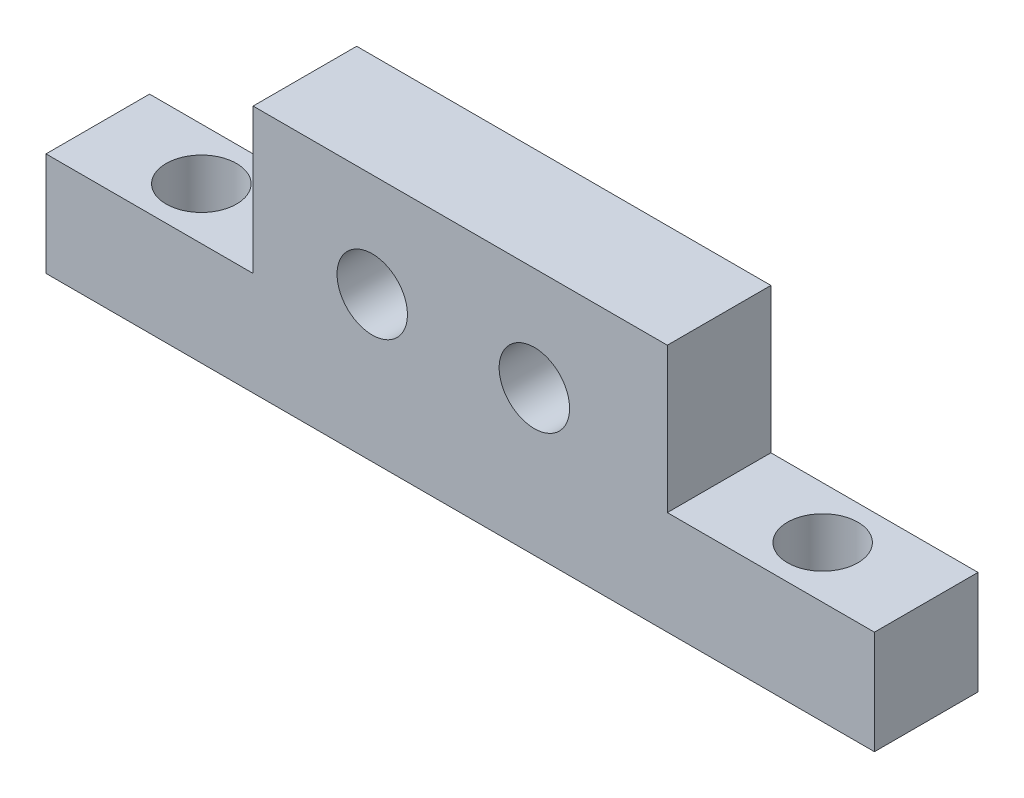
ISO-10303-21;
HEADER;
FILE_DESCRIPTION(('STEP AP214'),'2;1');
FILE_NAME('part.step','',(''),(''),'','','');
FILE_SCHEMA(('AUTOMOTIVE_DESIGN { 1 0 10303 214 1 1 1 1 }'));
ENDSEC;
DATA;
#1=APPLICATION_CONTEXT('core data for automotive mechanical design processes');
#2=APPLICATION_PROTOCOL_DEFINITION('international standard','automotive_design',2000,#1);
#3=PRODUCT_CONTEXT('',#1,'mechanical');
#4=PRODUCT('Part','Part','',(#3));
#5=PRODUCT_RELATED_PRODUCT_CATEGORY('part','',(#4));
#6=PRODUCT_DEFINITION_FORMATION('','',#4);
#7=PRODUCT_DEFINITION_CONTEXT('part definition',#1,'design');
#8=PRODUCT_DEFINITION('design','',#6,#7);
#9=PRODUCT_DEFINITION_SHAPE('','',#8);
#10=(LENGTH_UNIT() NAMED_UNIT(*) SI_UNIT(.MILLI.,.METRE.));
#11=(NAMED_UNIT(*) PLANE_ANGLE_UNIT() SI_UNIT($,.RADIAN.));
#12=(NAMED_UNIT(*) SI_UNIT($,.STERADIAN.) SOLID_ANGLE_UNIT());
#13=UNCERTAINTY_MEASURE_WITH_UNIT(LENGTH_MEASURE(1.E-05),#10,'distance_accuracy_value','');
#14=(GEOMETRIC_REPRESENTATION_CONTEXT(3) GLOBAL_UNCERTAINTY_ASSIGNED_CONTEXT((#13)) GLOBAL_UNIT_ASSIGNED_CONTEXT((#10,
#11,#12)) REPRESENTATION_CONTEXT('',''));
#15=CARTESIAN_POINT('',(0.,0.,0.));
#16=DIRECTION('',(0.,0.,1.));
#17=DIRECTION('',(1.,0.,0.));
#18=AXIS2_PLACEMENT_3D('',#15,#16,#17);
#19=CARTESIAN_POINT('',(-10.,-3.5,5.));
#20=DIRECTION('',(1.,0.,0.));
#21=DIRECTION('',(0.,0.,-1.));
#22=AXIS2_PLACEMENT_3D('',#19,#20,#21);
#23=PLANE('',#22);
#24=DIRECTION('',(0.,-1.,0.));
#25=VECTOR('',#24,1.);
#26=CARTESIAN_POINT('',(-10.,-3.5,0.));
#27=LINE('',#26,#25);
#28=CARTESIAN_POINT('',(-10.,3.5,0.));
#29=VERTEX_POINT('',#28);
#30=CARTESIAN_POINT('',(-10.,-3.5,0.));
#31=VERTEX_POINT('',#30);
#32=EDGE_CURVE('E146',#29,#31,#27,.T.);
#33=ORIENTED_EDGE('',*,*,#32,.T.);
#34=DIRECTION('',(0.,0.,-1.));
#35=VECTOR('',#34,1.);
#36=CARTESIAN_POINT('',(-10.,-3.5,5.));
#37=LINE('',#36,#35);
#38=CARTESIAN_POINT('',(-10.,-3.5,5.));
#39=VERTEX_POINT('',#38);
#40=EDGE_CURVE('E11',#39,#31,#37,.T.);
#41=ORIENTED_EDGE('',*,*,#40,.F.);
#42=DIRECTION('',(0.,-1.,0.));
#43=VECTOR('',#42,1.);
#44=CARTESIAN_POINT('',(-10.,-3.5,5.));
#45=LINE('',#44,#43);
#46=CARTESIAN_POINT('',(-10.,3.5,5.));
#47=VERTEX_POINT('',#46);
#48=EDGE_CURVE('E169',#47,#39,#45,.T.);
#49=ORIENTED_EDGE('',*,*,#48,.F.);
#50=DIRECTION('',(0.,0.,-1.));
#51=VECTOR('',#50,1.);
#52=CARTESIAN_POINT('',(-10.,3.5,5.));
#53=LINE('',#52,#51);
#54=EDGE_CURVE('E142',#47,#29,#53,.T.);
#55=ORIENTED_EDGE('',*,*,#54,.T.);
#56=EDGE_LOOP('',(#33,#41,#49,#55));
#57=FACE_BOUND('',#56,.T.);
#58=ADVANCED_FACE('F45',(#57),#23,.F.);
#59=CARTESIAN_POINT('',(-20.,-3.5,5.));
#60=DIRECTION('',(0.,-1.,0.));
#61=DIRECTION('',(0.,0.,-1.));
#62=AXIS2_PLACEMENT_3D('',#59,#60,#61);
#63=PLANE('',#62);
#64=CARTESIAN_POINT('',(-15.,-3.5,2.5));
#65=DIRECTION('',(0.,1.,0.));
#66=DIRECTION('',(0.,0.,1.));
#67=AXIS2_PLACEMENT_3D('',#64,#65,#66);
#68=CIRCLE('',#67,1.69999999999999);
#69=CARTESIAN_POINT('',(-15.,-3.5,4.19999999999999));
#70=VERTEX_POINT('',#69);
#71=EDGE_CURVE('E240',#70,#70,#68,.T.);
#72=ORIENTED_EDGE('',*,*,#71,.F.);
#73=EDGE_LOOP('',(#72));
#74=FACE_BOUND('',#73,.T.);
#75=DIRECTION('',(-1.,0.,0.));
#76=VECTOR('',#75,1.);
#77=CARTESIAN_POINT('',(-20.,-3.5,0.));
#78=LINE('',#77,#76);
#79=CARTESIAN_POINT('',(-20.,-3.5,0.));
#80=VERTEX_POINT('',#79);
#81=EDGE_CURVE('E150',#31,#80,#78,.T.);
#82=ORIENTED_EDGE('',*,*,#81,.T.);
#83=DIRECTION('',(0.,0.,-1.));
#84=VECTOR('',#83,1.);
#85=CARTESIAN_POINT('',(-20.,-3.5,5.));
#86=LINE('',#85,#84);
#87=CARTESIAN_POINT('',(-20.,-3.5,5.));
#88=VERTEX_POINT('',#87);
#89=EDGE_CURVE('E54',#88,#80,#86,.T.);
#90=ORIENTED_EDGE('',*,*,#89,.F.);
#91=DIRECTION('',(-1.,0.,0.));
#92=VECTOR('',#91,1.);
#93=CARTESIAN_POINT('',(-20.,-3.5,5.));
#94=LINE('',#93,#92);
#95=EDGE_CURVE('E105',#39,#88,#94,.T.);
#96=ORIENTED_EDGE('',*,*,#95,.F.);
#97=ORIENTED_EDGE('',*,*,#40,.T.);
#98=EDGE_LOOP('',(#82,#90,#96,#97));
#99=FACE_BOUND('',#98,.T.);
#100=ADVANCED_FACE('F247',(#74,#99),#63,.F.);
#101=CARTESIAN_POINT('',(-20.,-3.5,5.));
#102=DIRECTION('',(1.,0.,0.));
#103=DIRECTION('',(0.,0.,-1.));
#104=AXIS2_PLACEMENT_3D('',#101,#102,#103);
#105=PLANE('',#104);
#106=DIRECTION('',(0.,-1.,0.));
#107=VECTOR('',#106,1.);
#108=CARTESIAN_POINT('',(-20.,-3.5,0.));
#109=LINE('',#108,#107);
#110=CARTESIAN_POINT('',(-20.,-8.5,0.));
#111=VERTEX_POINT('',#110);
#112=EDGE_CURVE('E154',#80,#111,#109,.T.);
#113=ORIENTED_EDGE('',*,*,#112,.T.);
#114=DIRECTION('',(0.,0.,-1.));
#115=VECTOR('',#114,1.);
#116=CARTESIAN_POINT('',(-20.,-8.5,5.));
#117=LINE('',#116,#115);
#118=CARTESIAN_POINT('',(-20.,-8.5,5.));
#119=VERTEX_POINT('',#118);
#120=EDGE_CURVE('E180',#119,#111,#117,.T.);
#121=ORIENTED_EDGE('',*,*,#120,.F.);
#122=DIRECTION('',(0.,-1.,0.));
#123=VECTOR('',#122,1.);
#124=CARTESIAN_POINT('',(-20.,-3.5,5.));
#125=LINE('',#124,#123);
#126=EDGE_CURVE('E190',#88,#119,#125,.T.);
#127=ORIENTED_EDGE('',*,*,#126,.F.);
#128=ORIENTED_EDGE('',*,*,#89,.T.);
#129=EDGE_LOOP('',(#113,#121,#127,#128));
#130=FACE_BOUND('',#129,.T.);
#131=ADVANCED_FACE('F188',(#130),#105,.F.);
#132=CARTESIAN_POINT('',(-20.,-8.5,5.));
#133=DIRECTION('',(0.,1.,0.));
#134=DIRECTION('',(0.,0.,1.));
#135=AXIS2_PLACEMENT_3D('',#132,#133,#134);
#136=PLANE('',#135);
#137=CARTESIAN_POINT('',(-15.,-8.5,2.5));
#138=DIRECTION('',(0.,1.,0.));
#139=DIRECTION('',(0.,0.,1.));
#140=AXIS2_PLACEMENT_3D('',#137,#138,#139);
#141=CIRCLE('',#140,1.7);
#142=CARTESIAN_POINT('',(-15.,-8.5,4.2));
#143=VERTEX_POINT('',#142);
#144=EDGE_CURVE('E236',#143,#143,#141,.T.);
#145=ORIENTED_EDGE('',*,*,#144,.T.);
#146=EDGE_LOOP('',(#145));
#147=FACE_BOUND('',#146,.T.);
#148=CARTESIAN_POINT('',(15.,-8.5,2.5));
#149=DIRECTION('',(0.,1.,0.));
#150=DIRECTION('',(0.,0.,1.));
#151=AXIS2_PLACEMENT_3D('',#148,#149,#150);
#152=CIRCLE('',#151,1.7);
#153=CARTESIAN_POINT('',(15.,-8.5,4.2));
#154=VERTEX_POINT('',#153);
#155=EDGE_CURVE('E228',#154,#154,#152,.T.);
#156=ORIENTED_EDGE('',*,*,#155,.T.);
#157=EDGE_LOOP('',(#156));
#158=FACE_BOUND('',#157,.T.);
#159=DIRECTION('',(1.,0.,0.));
#160=VECTOR('',#159,1.);
#161=CARTESIAN_POINT('',(-20.,-8.5,0.));
#162=LINE('',#161,#160);
#163=CARTESIAN_POINT('',(20.,-8.5,0.));
#164=VERTEX_POINT('',#163);
#165=EDGE_CURVE('E157',#111,#164,#162,.T.);
#166=ORIENTED_EDGE('',*,*,#165,.T.);
#167=DIRECTION('',(0.,0.,-1.));
#168=VECTOR('',#167,1.);
#169=CARTESIAN_POINT('',(20.,-8.5,5.));
#170=LINE('',#169,#168);
#171=CARTESIAN_POINT('',(20.,-8.5,5.));
#172=VERTEX_POINT('',#171);
#173=EDGE_CURVE('E176',#172,#164,#170,.T.);
#174=ORIENTED_EDGE('',*,*,#173,.F.);
#175=DIRECTION('',(1.,0.,0.));
#176=VECTOR('',#175,1.);
#177=CARTESIAN_POINT('',(-20.,-8.5,5.));
#178=LINE('',#177,#176);
#179=EDGE_CURVE('E203',#119,#172,#178,.T.);
#180=ORIENTED_EDGE('',*,*,#179,.F.);
#181=ORIENTED_EDGE('',*,*,#120,.T.);
#182=EDGE_LOOP('',(#166,#174,#180,#181));
#183=FACE_BOUND('',#182,.T.);
#184=ADVANCED_FACE('F198',(#147,#158,#183),#136,.F.);
#185=CARTESIAN_POINT('',(20.,-3.5,5.));
#186=DIRECTION('',(-1.,0.,0.));
#187=DIRECTION('',(0.,0.,1.));
#188=AXIS2_PLACEMENT_3D('',#185,#186,#187);
#189=PLANE('',#188);
#190=DIRECTION('',(0.,1.,0.));
#191=VECTOR('',#190,1.);
#192=CARTESIAN_POINT('',(20.,-3.5,0.));
#193=LINE('',#192,#191);
#194=CARTESIAN_POINT('',(20.,-3.5,0.));
#195=VERTEX_POINT('',#194);
#196=EDGE_CURVE('E160',#164,#195,#193,.T.);
#197=ORIENTED_EDGE('',*,*,#196,.T.);
#198=DIRECTION('',(0.,0.,-1.));
#199=VECTOR('',#198,1.);
#200=CARTESIAN_POINT('',(20.,-3.5,5.));
#201=LINE('',#200,#199);
#202=CARTESIAN_POINT('',(20.,-3.5,5.));
#203=VERTEX_POINT('',#202);
#204=EDGE_CURVE('E135',#203,#195,#201,.T.);
#205=ORIENTED_EDGE('',*,*,#204,.F.);
#206=DIRECTION('',(0.,1.,0.));
#207=VECTOR('',#206,1.);
#208=CARTESIAN_POINT('',(20.,-3.5,5.));
#209=LINE('',#208,#207);
#210=EDGE_CURVE('E124',#172,#203,#209,.T.);
#211=ORIENTED_EDGE('',*,*,#210,.F.);
#212=ORIENTED_EDGE('',*,*,#173,.T.);
#213=EDGE_LOOP('',(#197,#205,#211,#212));
#214=FACE_BOUND('',#213,.T.);
#215=ADVANCED_FACE('F201',(#214),#189,.F.);
#216=CARTESIAN_POINT('',(10.,-3.5,5.));
#217=DIRECTION('',(0.,-1.,0.));
#218=DIRECTION('',(0.,0.,-1.));
#219=AXIS2_PLACEMENT_3D('',#216,#217,#218);
#220=PLANE('',#219);
#221=CARTESIAN_POINT('',(15.,-3.5,2.5));
#222=DIRECTION('',(0.,1.,0.));
#223=DIRECTION('',(0.,0.,1.));
#224=AXIS2_PLACEMENT_3D('',#221,#222,#223);
#225=CIRCLE('',#224,1.69999999999999);
#226=CARTESIAN_POINT('',(15.,-3.5,4.19999999999999));
#227=VERTEX_POINT('',#226);
#228=EDGE_CURVE('E232',#227,#227,#225,.T.);
#229=ORIENTED_EDGE('',*,*,#228,.F.);
#230=EDGE_LOOP('',(#229));
#231=FACE_BOUND('',#230,.T.);
#232=DIRECTION('',(-1.,0.,0.));
#233=VECTOR('',#232,1.);
#234=CARTESIAN_POINT('',(10.,-3.5,0.));
#235=LINE('',#234,#233);
#236=CARTESIAN_POINT('',(10.,-3.5,0.));
#237=VERTEX_POINT('',#236);
#238=EDGE_CURVE('E133',#195,#237,#235,.T.);
#239=ORIENTED_EDGE('',*,*,#238,.T.);
#240=DIRECTION('',(0.,0.,-1.));
#241=VECTOR('',#240,1.);
#242=CARTESIAN_POINT('',(10.,-3.5,5.));
#243=LINE('',#242,#241);
#244=CARTESIAN_POINT('',(10.,-3.5,5.));
#245=VERTEX_POINT('',#244);
#246=EDGE_CURVE('E130',#245,#237,#243,.T.);
#247=ORIENTED_EDGE('',*,*,#246,.F.);
#248=DIRECTION('',(-1.,0.,0.));
#249=VECTOR('',#248,1.);
#250=CARTESIAN_POINT('',(10.,-3.5,5.));
#251=LINE('',#250,#249);
#252=EDGE_CURVE('E118',#203,#245,#251,.T.);
#253=ORIENTED_EDGE('',*,*,#252,.F.);
#254=ORIENTED_EDGE('',*,*,#204,.T.);
#255=EDGE_LOOP('',(#239,#247,#253,#254));
#256=FACE_BOUND('',#255,.T.);
#257=ADVANCED_FACE('F131',(#231,#256),#220,.F.);
#258=CARTESIAN_POINT('',(10.,-3.5,5.));
#259=DIRECTION('',(-1.,0.,0.));
#260=DIRECTION('',(0.,0.,1.));
#261=AXIS2_PLACEMENT_3D('',#258,#259,#260);
#262=PLANE('',#261);
#263=DIRECTION('',(0.,1.,0.));
#264=VECTOR('',#263,1.);
#265=CARTESIAN_POINT('',(10.,-3.5,0.));
#266=LINE('',#265,#264);
#267=CARTESIAN_POINT('',(10.,3.5,0.));
#268=VERTEX_POINT('',#267);
#269=EDGE_CURVE('E91',#237,#268,#266,.T.);
#270=ORIENTED_EDGE('',*,*,#269,.T.);
#271=DIRECTION('',(0.,0.,-1.));
#272=VECTOR('',#271,1.);
#273=CARTESIAN_POINT('',(10.,3.5,5.));
#274=LINE('',#273,#272);
#275=CARTESIAN_POINT('',(10.,3.5,5.));
#276=VERTEX_POINT('',#275);
#277=EDGE_CURVE('E136',#276,#268,#274,.T.);
#278=ORIENTED_EDGE('',*,*,#277,.F.);
#279=DIRECTION('',(0.,1.,0.));
#280=VECTOR('',#279,1.);
#281=CARTESIAN_POINT('',(10.,-3.5,5.));
#282=LINE('',#281,#280);
#283=EDGE_CURVE('E122',#245,#276,#282,.T.);
#284=ORIENTED_EDGE('',*,*,#283,.F.);
#285=ORIENTED_EDGE('',*,*,#246,.T.);
#286=EDGE_LOOP('',(#270,#278,#284,#285));
#287=FACE_BOUND('',#286,.T.);
#288=ADVANCED_FACE('F138',(#287),#262,.F.);
#289=CARTESIAN_POINT('',(10.,3.5,5.));
#290=DIRECTION('',(0.,-1.,0.));
#291=DIRECTION('',(1.,0.,0.));
#292=AXIS2_PLACEMENT_3D('',#289,#290,#291);
#293=PLANE('',#292);
#294=DIRECTION('',(-1.,0.,0.));
#295=VECTOR('',#294,1.);
#296=CARTESIAN_POINT('',(10.,3.5,0.));
#297=LINE('',#296,#295);
#298=EDGE_CURVE('E97',#268,#29,#297,.T.);
#299=ORIENTED_EDGE('',*,*,#298,.T.);
#300=ORIENTED_EDGE('',*,*,#54,.F.);
#301=DIRECTION('',(-1.,0.,0.));
#302=VECTOR('',#301,1.);
#303=CARTESIAN_POINT('',(10.,3.5,5.));
#304=LINE('',#303,#302);
#305=EDGE_CURVE('E62',#276,#47,#304,.T.);
#306=ORIENTED_EDGE('',*,*,#305,.F.);
#307=ORIENTED_EDGE('',*,*,#277,.T.);
#308=EDGE_LOOP('',(#299,#300,#306,#307));
#309=FACE_BOUND('',#308,.T.);
#310=ADVANCED_FACE('F252',(#309),#293,.F.);
#311=CARTESIAN_POINT('',(0.,0.,5.));
#312=DIRECTION('',(0.,0.,1.));
#313=DIRECTION('',(1.,0.,0.));
#314=AXIS2_PLACEMENT_3D('',#311,#312,#313);
#315=PLANE('',#314);
#316=CARTESIAN_POINT('',(3.58001928062672,-1.5,5.));
#317=DIRECTION('',(0.,0.,1.));
#318=DIRECTION('',(1.,0.,0.));
#319=AXIS2_PLACEMENT_3D('',#316,#317,#318);
#320=CIRCLE('',#319,1.7);
#321=CARTESIAN_POINT('',(5.28001928062672,-1.5,5.));
#322=VERTEX_POINT('',#321);
#323=EDGE_CURVE('E224',#322,#322,#320,.T.);
#324=ORIENTED_EDGE('',*,*,#323,.F.);
#325=EDGE_LOOP('',(#324));
#326=FACE_BOUND('',#325,.T.);
#327=CARTESIAN_POINT('',(-4.24828954634369,-1.5,5.));
#328=DIRECTION('',(0.,0.,1.));
#329=DIRECTION('',(1.,0.,0.));
#330=AXIS2_PLACEMENT_3D('',#327,#328,#329);
#331=CIRCLE('',#330,1.7);
#332=CARTESIAN_POINT('',(-2.5482895463437,-1.5,5.));
#333=VERTEX_POINT('',#332);
#334=EDGE_CURVE('E216',#333,#333,#331,.T.);
#335=ORIENTED_EDGE('',*,*,#334,.F.);
#336=EDGE_LOOP('',(#335));
#337=FACE_BOUND('',#336,.T.);
#338=ORIENTED_EDGE('',*,*,#48,.T.);
#339=ORIENTED_EDGE('',*,*,#95,.T.);
#340=ORIENTED_EDGE('',*,*,#126,.T.);
#341=ORIENTED_EDGE('',*,*,#179,.T.);
#342=ORIENTED_EDGE('',*,*,#210,.T.);
#343=ORIENTED_EDGE('',*,*,#252,.T.);
#344=ORIENTED_EDGE('',*,*,#283,.T.);
#345=ORIENTED_EDGE('',*,*,#305,.T.);
#346=EDGE_LOOP('',(#338,#339,#340,#341,#342,#343,#344,#345));
#347=FACE_BOUND('',#346,.T.);
#348=ADVANCED_FACE('F120',(#326,#337,#347),#315,.T.);
#349=CARTESIAN_POINT('',(0.,0.,0.));
#350=DIRECTION('',(0.,0.,1.));
#351=DIRECTION('',(1.,0.,0.));
#352=AXIS2_PLACEMENT_3D('',#349,#350,#351);
#353=PLANE('',#352);
#354=CARTESIAN_POINT('',(3.58001928062672,-1.5,0.));
#355=DIRECTION('',(0.,0.,1.));
#356=DIRECTION('',(1.,0.,0.));
#357=AXIS2_PLACEMENT_3D('',#354,#355,#356);
#358=CIRCLE('',#357,1.7);
#359=CARTESIAN_POINT('',(5.28001928062672,-1.5,0.));
#360=VERTEX_POINT('',#359);
#361=EDGE_CURVE('E220',#360,#360,#358,.T.);
#362=ORIENTED_EDGE('',*,*,#361,.T.);
#363=EDGE_LOOP('',(#362));
#364=FACE_BOUND('',#363,.T.);
#365=CARTESIAN_POINT('',(-4.24828954634369,-1.5,0.));
#366=DIRECTION('',(0.,0.,1.));
#367=DIRECTION('',(1.,0.,0.));
#368=AXIS2_PLACEMENT_3D('',#365,#366,#367);
#369=CIRCLE('',#368,1.7);
#370=CARTESIAN_POINT('',(-2.5482895463437,-1.5,0.));
#371=VERTEX_POINT('',#370);
#372=EDGE_CURVE('E151',#371,#371,#369,.T.);
#373=ORIENTED_EDGE('',*,*,#372,.T.);
#374=EDGE_LOOP('',(#373));
#375=FACE_BOUND('',#374,.T.);
#376=ORIENTED_EDGE('',*,*,#32,.F.);
#377=ORIENTED_EDGE('',*,*,#298,.F.);
#378=ORIENTED_EDGE('',*,*,#269,.F.);
#379=ORIENTED_EDGE('',*,*,#238,.F.);
#380=ORIENTED_EDGE('',*,*,#196,.F.);
#381=ORIENTED_EDGE('',*,*,#165,.F.);
#382=ORIENTED_EDGE('',*,*,#112,.F.);
#383=ORIENTED_EDGE('',*,*,#81,.F.);
#384=EDGE_LOOP('',(#376,#377,#378,#379,#380,#381,#382,#383));
#385=FACE_BOUND('',#384,.T.);
#386=ADVANCED_FACE('F194',(#364,#375,#385),#353,.F.);
#387=CARTESIAN_POINT('',(-4.24828954634369,-1.5,5.));
#388=DIRECTION('',(0.,0.,1.));
#389=DIRECTION('',(1.,0.,0.));
#390=AXIS2_PLACEMENT_3D('',#387,#388,#389);
#391=CYLINDRICAL_SURFACE('',#390,1.7);
#392=ORIENTED_EDGE('',*,*,#372,.F.);
#393=EDGE_LOOP('',(#392));
#394=FACE_BOUND('',#393,.T.);
#395=ORIENTED_EDGE('',*,*,#334,.T.);
#396=EDGE_LOOP('',(#395));
#397=FACE_BOUND('',#396,.T.);
#398=ADVANCED_FACE('F312',(#394,#397),#391,.F.);
#399=CARTESIAN_POINT('',(3.58001928062672,-1.5,5.));
#400=DIRECTION('',(0.,0.,1.));
#401=DIRECTION('',(1.,0.,0.));
#402=AXIS2_PLACEMENT_3D('',#399,#400,#401);
#403=CYLINDRICAL_SURFACE('',#402,1.7);
#404=ORIENTED_EDGE('',*,*,#361,.F.);
#405=EDGE_LOOP('',(#404));
#406=FACE_BOUND('',#405,.T.);
#407=ORIENTED_EDGE('',*,*,#323,.T.);
#408=EDGE_LOOP('',(#407));
#409=FACE_BOUND('',#408,.T.);
#410=ADVANCED_FACE('F321',(#406,#409),#403,.F.);
#411=CARTESIAN_POINT('',(15.,-3.5,2.5));
#412=DIRECTION('',(0.,1.,0.));
#413=DIRECTION('',(0.,0.,1.));
#414=AXIS2_PLACEMENT_3D('',#411,#412,#413);
#415=CYLINDRICAL_SURFACE('',#414,1.69999999999999);
#416=ORIENTED_EDGE('',*,*,#155,.F.);
#417=EDGE_LOOP('',(#416));
#418=FACE_BOUND('',#417,.T.);
#419=ORIENTED_EDGE('',*,*,#228,.T.);
#420=EDGE_LOOP('',(#419));
#421=FACE_BOUND('',#420,.T.);
#422=ADVANCED_FACE('F331',(#418,#421),#415,.F.);
#423=CARTESIAN_POINT('',(-15.,-3.5,2.5));
#424=DIRECTION('',(0.,1.,0.));
#425=DIRECTION('',(0.,0.,1.));
#426=AXIS2_PLACEMENT_3D('',#423,#424,#425);
#427=CYLINDRICAL_SURFACE('',#426,1.69999999999999);
#428=ORIENTED_EDGE('',*,*,#144,.F.);
#429=EDGE_LOOP('',(#428));
#430=FACE_BOUND('',#429,.T.);
#431=ORIENTED_EDGE('',*,*,#71,.T.);
#432=EDGE_LOOP('',(#431));
#433=FACE_BOUND('',#432,.T.);
#434=ADVANCED_FACE('F245',(#430,#433),#427,.F.);
#435=CLOSED_SHELL('',(#58,#100,#131,#184,#215,#257,#288,#310,#348,#386,#398,#410,#422,#434));
#436=MANIFOLD_SOLID_BREP('B2',#435);
#437=ADVANCED_BREP_SHAPE_REPRESENTATION('',(#18,#436),#14);
#438=SHAPE_DEFINITION_REPRESENTATION(#9,#437);
ENDSEC;
END-ISO-10303-21;
